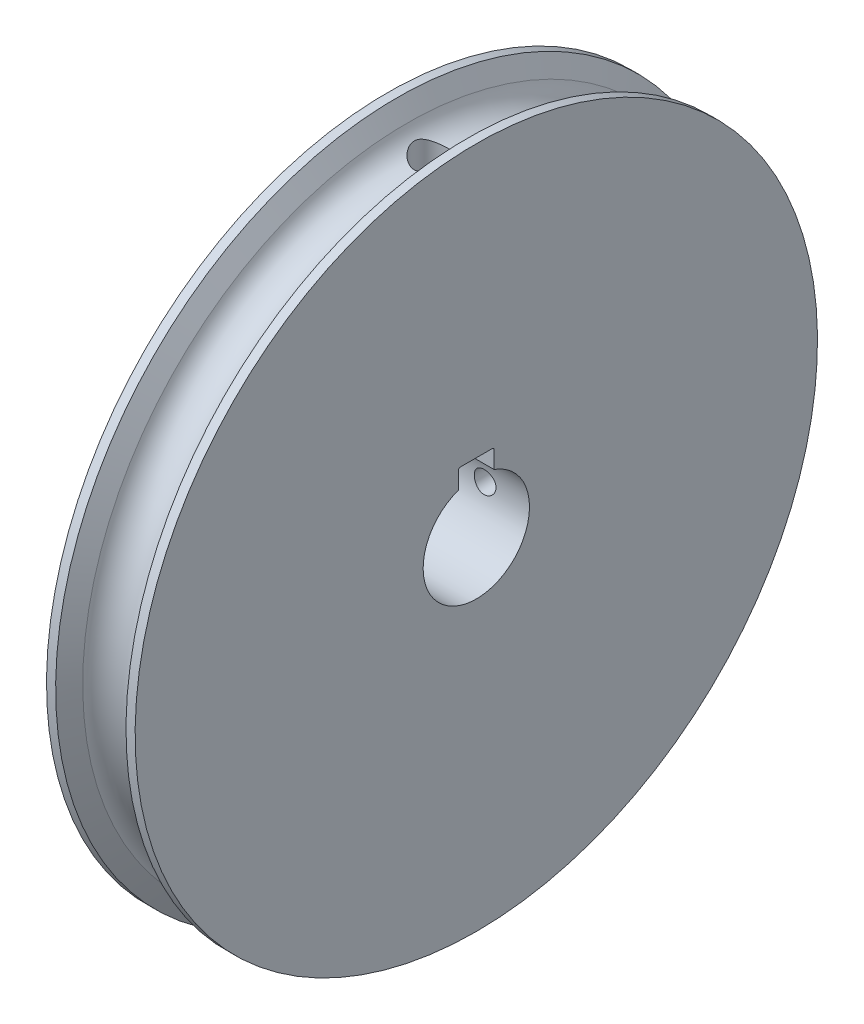
ISO-10303-21;
HEADER;
FILE_DESCRIPTION(('STEP AP214'),'2;1');
FILE_NAME('part.step','',(''),(''),'','','');
FILE_SCHEMA(('AUTOMOTIVE_DESIGN { 1 0 10303 214 1 1 1 1 }'));
ENDSEC;
DATA;
#1=APPLICATION_CONTEXT('core data for automotive mechanical design processes');
#2=APPLICATION_PROTOCOL_DEFINITION('international standard','automotive_design',2000,#1);
#3=PRODUCT_CONTEXT('',#1,'mechanical');
#4=PRODUCT('Part','Part','',(#3));
#5=PRODUCT_RELATED_PRODUCT_CATEGORY('part','',(#4));
#6=PRODUCT_DEFINITION_FORMATION('','',#4);
#7=PRODUCT_DEFINITION_CONTEXT('part definition',#1,'design');
#8=PRODUCT_DEFINITION('design','',#6,#7);
#9=PRODUCT_DEFINITION_SHAPE('','',#8);
#10=(LENGTH_UNIT() NAMED_UNIT(*) SI_UNIT(.MILLI.,.METRE.));
#11=(NAMED_UNIT(*) PLANE_ANGLE_UNIT() SI_UNIT($,.RADIAN.));
#12=(NAMED_UNIT(*) SI_UNIT($,.STERADIAN.) SOLID_ANGLE_UNIT());
#13=UNCERTAINTY_MEASURE_WITH_UNIT(LENGTH_MEASURE(1.E-05),#10,'distance_accuracy_value','');
#14=(GEOMETRIC_REPRESENTATION_CONTEXT(3) GLOBAL_UNCERTAINTY_ASSIGNED_CONTEXT((#13)) GLOBAL_UNIT_ASSIGNED_CONTEXT((#10,
#11,#12)) REPRESENTATION_CONTEXT('',''));
#15=CARTESIAN_POINT('',(0.,0.,0.));
#16=DIRECTION('',(0.,0.,1.));
#17=DIRECTION('',(1.,0.,0.));
#18=AXIS2_PLACEMENT_3D('',#15,#16,#17);
#19=CARTESIAN_POINT('',(5.,0.,0.));
#20=DIRECTION('',(-1.,0.,0.));
#21=DIRECTION('',(0.,-1.,0.));
#22=AXIS2_PLACEMENT_3D('',#19,#20,#21);
#23=CYLINDRICAL_SURFACE('',#22,38.5);
#24=CARTESIAN_POINT('',(5.,0.,0.));
#25=DIRECTION('',(-1.,0.,0.));
#26=DIRECTION('',(0.,-1.,0.));
#27=AXIS2_PLACEMENT_3D('',#24,#25,#26);
#28=CIRCLE('',#27,38.5);
#29=CARTESIAN_POINT('',(5.,-38.5,0.));
#30=VERTEX_POINT('',#29);
#31=EDGE_CURVE('E105',#30,#30,#28,.T.);
#32=ORIENTED_EDGE('',*,*,#31,.T.);
#33=EDGE_LOOP('',(#32));
#34=FACE_BOUND('',#33,.T.);
#35=CARTESIAN_POINT('',(3.96811878506867,0.,0.));
#36=DIRECTION('',(-1.,0.,0.));
#37=DIRECTION('',(0.,-1.,0.));
#38=AXIS2_PLACEMENT_3D('',#35,#36,#37);
#39=CIRCLE('',#38,38.5);
#40=CARTESIAN_POINT('',(3.96811878506867,-38.5,0.));
#41=VERTEX_POINT('',#40);
#42=EDGE_CURVE('E147',#41,#41,#39,.T.);
#43=ORIENTED_EDGE('',*,*,#42,.F.);
#44=EDGE_LOOP('',(#43));
#45=FACE_BOUND('',#44,.T.);
#46=ADVANCED_FACE('F33',(#34,#45),#23,.T.);
#47=CARTESIAN_POINT('',(2.85008479631878,0.,0.));
#48=DIRECTION('',(1.,0.,0.));
#49=DIRECTION('',(0.,1.,0.));
#50=AXIS2_PLACEMENT_3D('',#47,#48,#49);
#51=CONICAL_SURFACE('',#50,36.5635083268963,1.0471975511966);
#52=ORIENTED_EDGE('',*,*,#42,.T.);
#53=EDGE_LOOP('',(#52));
#54=FACE_BOUND('',#53,.T.);
#55=CARTESIAN_POINT('',(2.85008479631878,0.,0.));
#56=DIRECTION('',(-1.,0.,0.));
#57=DIRECTION('',(0.,-1.,0.));
#58=AXIS2_PLACEMENT_3D('',#55,#56,#57);
#59=CIRCLE('',#58,36.5635083268963);
#60=CARTESIAN_POINT('',(2.85008479631878,-36.5635083268963,0.));
#61=VERTEX_POINT('',#60);
#62=EDGE_CURVE('E144',#61,#61,#59,.T.);
#63=ORIENTED_EDGE('',*,*,#62,.F.);
#64=EDGE_LOOP('',(#63));
#65=FACE_BOUND('',#64,.T.);
#66=ADVANCED_FACE('F210',(#54,#65),#51,.T.);
#67=CARTESIAN_POINT('',(0.,0.,0.));
#68=DIRECTION('',(-1.,0.,0.));
#69=DIRECTION('',(0.,-1.,0.));
#70=AXIS2_PLACEMENT_3D('',#67,#68,#69);
#71=TOROIDAL_SURFACE('',#70,37.5,3.);
#72=CARTESIAN_POINT('',(-1.15413941724156,34.692461094384,-1.63338981101617));
#73=CARTESIAN_POINT('',(-1.25230378169774,34.7366892183068,-1.56402977918302));
#74=CARTESIAN_POINT('',(-1.34326250195518,34.7842256740335,-1.4865076607575));
#75=CARTESIAN_POINT('',(-1.50984156033293,34.8811479788153,-1.3170253662496));
#76=CARTESIAN_POINT('',(-1.58541668049777,34.9305387885207,-1.22502399672636));
#77=CARTESIAN_POINT('',(-1.72019212264538,35.0259229680696,-1.02729723519172));
#78=CARTESIAN_POINT('',(-1.77931106138128,35.0718986559854,-0.921507304963747));
#79=CARTESIAN_POINT('',(-1.87830408799473,35.1531929539632,-0.697706223730167));
#80=CARTESIAN_POINT('',(-1.91826018696473,35.1885567317905,-0.579749826312477));
#81=CARTESIAN_POINT('',(-1.96589158550592,35.2318262571962,-0.37693257407509));
#82=CARTESIAN_POINT('',(-1.97994790269483,35.2449957973718,-0.29469266150319));
#83=CARTESIAN_POINT('',(-1.99763853489898,35.2616536028737,-0.128162141087988));
#84=CARTESIAN_POINT('',(-2.00128534241967,35.2651534726585,-0.0438741138773785));
#85=CARTESIAN_POINT('',(-1.99790564236217,35.2619412198332,0.124319577006549));
#86=CARTESIAN_POINT('',(-1.99087395417937,35.2552241405323,0.208225035268269));
#87=CARTESIAN_POINT('',(-1.96662664448319,35.2325888515065,0.373315216826705));
#88=CARTESIAN_POINT('',(-1.94939681096507,35.2166578020199,0.454495975862765));
#89=CARTESIAN_POINT('',(-1.89932544733003,35.1719309098749,0.635414618105865));
#90=CARTESIAN_POINT('',(-1.86340366438842,35.1407428597673,0.73369715074629));
#91=CARTESIAN_POINT('',(-1.7780975469425,35.0711593498684,0.921436995301542));
#92=CARTESIAN_POINT('',(-1.72869330262463,35.0327532573739,1.01088098698074));
#93=CARTESIAN_POINT('',(-1.61653970547145,34.9519893265557,1.18215815698913));
#94=CARTESIAN_POINT('',(-1.553523887928,34.9095637918749,1.26378391890621));
#95=CARTESIAN_POINT('',(-1.41559977990129,34.8250865073783,1.41657140231414));
#96=CARTESIAN_POINT('',(-1.34068511933313,34.7830349705901,1.48772747929338));
#97=CARTESIAN_POINT('',(-1.16538662393937,34.6954607772761,1.62995356564607));
#98=CARTESIAN_POINT('',(-1.06284020732557,34.6506223071919,1.69882090819034));
#99=CARTESIAN_POINT('',(-0.843759682943349,34.571107956042,1.81755182623595));
#100=CARTESIAN_POINT('',(-0.727254680059566,34.5364114306797,1.86745406896164));
#101=CARTESIAN_POINT('',(-0.518114645596124,34.4895614347541,1.93390556274889));
#102=CARTESIAN_POINT('',(-0.427997062519046,34.4738111846652,1.955889909841));
#103=CARTESIAN_POINT('',(-0.244507864608128,34.4513014606904,1.98717199177387));
#104=CARTESIAN_POINT('',(-0.151139094534003,34.4445343199254,1.99648054529091));
#105=CARTESIAN_POINT('',(0.0363381340324808,34.4406219580363,2.00187171161903));
#106=CARTESIAN_POINT('',(0.130447559864104,34.4434926549763,1.99793244401988));
#107=CARTESIAN_POINT('',(0.316443611519483,34.4586108569616,1.97702520176859));
#108=CARTESIAN_POINT('',(0.408329409329265,34.4708618011534,1.96005244855054));
#109=CARTESIAN_POINT('',(0.58607374078757,34.5033835075449,1.91437189872763));
#110=CARTESIAN_POINT('',(0.672002093811127,34.5235309985971,1.88584426403442));
#111=CARTESIAN_POINT('',(0.837712593873513,34.5702914130123,1.81831037172738));
#112=CARTESIAN_POINT('',(0.917493459204588,34.5969056798741,1.77930193650648));
#113=CARTESIAN_POINT('',(1.07978157287123,34.6586069598435,1.68639023985453));
#114=CARTESIAN_POINT('',(1.16130869777871,34.6943444445486,1.63121355414477));
#115=CARTESIAN_POINT('',(1.31454962198745,34.7692897166195,1.51046205238269));
#116=CARTESIAN_POINT('',(1.38625098917966,34.8085017988707,1.4448742858935));
#117=CARTESIAN_POINT('',(1.53166972275211,34.8951178793617,1.29119371058307));
#118=CARTESIAN_POINT('',(1.60327325806761,34.9426868568972,1.20118467670636));
#119=CARTESIAN_POINT('',(1.73074629218862,35.0340043152423,1.00886366211702));
#120=CARTESIAN_POINT('',(1.78662618380259,35.0777553063575,0.906559871958913));
#121=CARTESIAN_POINT('',(1.86885467977422,35.1455607595233,0.717737618959305));
#122=CARTESIAN_POINT('',(1.89909551786027,35.1718021196619,0.633711259624011));
#123=CARTESIAN_POINT('',(1.94837927178807,35.2156826858437,0.460335280236325));
#124=CARTESIAN_POINT('',(1.96744235460812,35.2333373741371,0.370995569453687));
#125=CARTESIAN_POINT('',(1.99327850584055,35.2574844673992,0.18819184854205));
#126=CARTESIAN_POINT('',(1.99994473471001,35.2638798113305,0.0946990312850923));
#127=CARTESIAN_POINT('',(2.00005454761122,35.2639835510862,-0.092302756252155));
#128=CARTESIAN_POINT('',(1.99349928217178,35.2576930508273,-0.185811724418972));
#129=CARTESIAN_POINT('',(1.9692874137798,35.2350601366046,-0.358645253939931));
#130=CARTESIAN_POINT('',(1.95302392474172,35.2199840318559,-0.43834658037428));
#131=CARTESIAN_POINT('',(1.91155158307399,35.1827839382255,-0.593669000776356));
#132=CARTESIAN_POINT('',(1.88633461228924,35.1606535550712,-0.669286319834905));
#133=CARTESIAN_POINT('',(1.81434520284405,35.1001005784754,-0.849362898270387));
#134=CARTESIAN_POINT('',(1.76299484847957,35.0588704936857,-0.951047562273336));
#135=CARTESIAN_POINT('',(1.6450723152661,34.9717032148153,-1.14301030308801));
#136=CARTESIAN_POINT('',(1.57846969342849,34.9257567095108,-1.23326499889177));
#137=CARTESIAN_POINT('',(1.42988876751437,34.8331302591284,-1.40297908732453));
#138=CARTESIAN_POINT('',(1.34766191223214,34.7864515415155,-1.48222205661163));
#139=CARTESIAN_POINT('',(1.16951450428874,34.6975928580179,-1.62644694824355));
#140=CARTESIAN_POINT('',(1.07361500155134,34.6554061476526,-1.69145041007158));
#141=CARTESIAN_POINT('',(0.887054958295018,34.5862325915101,-1.79512155802151));
#142=CARTESIAN_POINT('',(0.798358547992226,34.5578787688613,-1.83639988523796));
#143=CARTESIAN_POINT('',(0.613887535200994,34.5093760665807,-1.90600055129711));
#144=CARTESIAN_POINT('',(0.518117940162055,34.4892214468915,-1.93433195567681));
#145=CARTESIAN_POINT('',(0.321251258114995,34.4589494567216,-1.97660905418097));
#146=CARTESIAN_POINT('',(0.220125983132287,34.4488922268299,-1.99046857232224));
#147=CARTESIAN_POINT('',(0.0164561945133712,34.4401483465175,-2.00252890840362));
#148=CARTESIAN_POINT('',(-0.0860878512932892,34.4414580331365,-2.00073477069428));
#149=CARTESIAN_POINT('',(-0.27889759491304,34.4545907762002,-1.98259071587212));
#150=CARTESIAN_POINT('',(-0.369378946286811,34.4653671173538,-1.96768979294115));
#151=CARTESIAN_POINT('',(-0.546170264235677,34.495053358758,-1.92612191842423));
#152=CARTESIAN_POINT('',(-0.632480167889638,34.5139633816526,-1.89945478942102));
#153=CARTESIAN_POINT('',(-0.794731727749451,34.5572473155712,-1.83726677201005));
#154=CARTESIAN_POINT('',(-0.870981138255738,34.5812741609108,-1.80229686097877));
#155=CARTESIAN_POINT('',(-1.01731169893415,34.6338437576692,-1.72394053369812));
#156=CARTESIAN_POINT('',(-1.08739131982433,34.6623876238273,-1.68055203925765));
#157=CARTESIAN_POINT('',(-1.15413941724156,34.692461094384,-1.63338981101617));
#158=B_SPLINE_CURVE_WITH_KNOTS('',3,(#72,#73,#74,#75,#76,#77,#78,#79,#80,#81,#82,#83,#84,#85,
#86,#87,#88,#89,#90,#91,#92,#93,#94,#95,#96,#97,#98,#99,#100,#101,#102,#103,#104,#105,#106,#107,
#108,#109,#110,#111,#112,#113,#114,#115,#116,#117,#118,#119,#120,#121,#122,#123,#124,#125,#126,
#127,#128,#129,#130,#131,#132,#133,#134,#135,#136,#137,#138,#139,#140,#141,#142,#143,#144,#145,
#146,#147,#148,#149,#150,#151,#152,#153,#154,#155,#156,#157),.UNSPECIFIED.,.T.,.F.,(4,2,2,2,2,2,
2,2,2,2,2,2,2,2,2,2,2,2,2,2,2,2,2,2,2,2,2,2,2,2,2,2,2,2,2,2,2,2,2,2,2,2,4),(0.,
0.383899910812011,0.768912446221426,1.15579651775696,1.54100973255824,1.79333121438528,
2.04534975634536,2.29749060257096,2.54998365912094,2.8757847187445,3.20206952317774,
3.53543878099646,3.86898711445636,4.2610190810902,4.65224740487232,4.9333006459964,
5.21411386003255,5.49539109934519,5.77677151473755,6.0539239302976,6.33113397469915,
6.64416914510999,6.95759679900477,7.32942646578239,7.70100978502768,7.97923195674305,
8.25695060125103,8.53705180459531,8.81712863470381,9.06433624961656,9.3117685833996,
9.67327001707356,10.0354993827277,10.4040642586035,10.7720677125067,11.0764026909134,
11.3805242438264,11.6864466025819,11.992270382282,12.2680147710441,12.5437633177725,
12.8047363975863,13.0657739827355),.UNSPECIFIED.);
#159=CARTESIAN_POINT('',(-1.15413941724156,34.692461094384,-1.63338981101617));
#160=VERTEX_POINT('',#159);
#161=EDGE_CURVE('E157',#160,#160,#158,.T.);
#162=ORIENTED_EDGE('',*,*,#161,.F.);
#163=EDGE_LOOP('',(#162));
#164=FACE_BOUND('',#163,.T.);
#165=CARTESIAN_POINT('',(-1.36904758300112,-1.45798107869875,-34.8000693125549));
#166=CARTESIAN_POINT('',(-1.45230066102804,-1.37980823084631,-34.8460841771348));
#167=CARTESIAN_POINT('',(-1.52856851885781,-1.29480005899666,-34.8934607267031));
#168=CARTESIAN_POINT('',(-1.66616980676115,-1.11219955605382,-34.9863525576055));
#169=CARTESIAN_POINT('',(-1.72746887929015,-1.01457904635514,-35.0318633611195));
#170=CARTESIAN_POINT('',(-1.82266800473996,-0.828538772640091,-35.106913428275));
#171=CARTESIAN_POINT('',(-1.85960069125495,-0.742235548056723,-35.1378225735872));
#172=CARTESIAN_POINT('',(-1.92142248770246,-0.563085836173174,-35.1913244071863));
#173=CARTESIAN_POINT('',(-1.9463427864739,-0.470257018644917,-35.2139385954757));
#174=CARTESIAN_POINT('',(-1.97991382844916,-0.294418270337335,-35.244896937915));
#175=CARTESIAN_POINT('',(-1.99046602878474,-0.212069601757359,-35.2548912682228));
#176=CARTESIAN_POINT('',(-2.00119369748807,-0.0461021289025892,-35.2650544071327));
#177=CARTESIAN_POINT('',(-2.00137495095492,0.0375159412367804,-35.2652286935296));
#178=CARTESIAN_POINT('',(-1.99136272323076,0.203411146937939,-35.2557387770639));
#179=CARTESIAN_POINT('',(-1.98118406489582,0.285690027702628,-35.2460886308943));
#180=CARTESIAN_POINT('',(-1.95113709803556,0.447010674580296,-35.2183419304));
#181=CARTESIAN_POINT('',(-1.93125624187717,0.526048104716766,-35.2002344396885));
#182=CARTESIAN_POINT('',(-1.87412995287297,0.706774904808957,-35.1500955064971));
#183=CARTESIAN_POINT('',(-1.833227136143,0.806560981909819,-35.1154035715571));
#184=CARTESIAN_POINT('',(-1.73736789044115,0.996450747955345,-35.0395175247242));
#185=CARTESIAN_POINT('',(-1.68238616089315,1.08653658664531,-34.9983117586735));
#186=CARTESIAN_POINT('',(-1.55828999585031,1.25824977342608,-34.9128212998097));
#187=CARTESIAN_POINT('',(-1.48889038341513,1.33964651123972,-34.8684887205271));
#188=CARTESIAN_POINT('',(-1.33756082557254,1.49075515237768,-34.7814664270744));
#189=CARTESIAN_POINT('',(-1.25564035108142,1.56047580477548,-34.7387755014346));
#190=CARTESIAN_POINT('',(-1.08519533192461,1.6830610200696,-34.6609312357362));
#191=CARTESIAN_POINT('',(-0.997356059147971,1.73668289900831,-34.6254801997364));
#192=CARTESIAN_POINT('',(-0.812271993451585,1.83056342348608,-34.5620203796626));
#193=CARTESIAN_POINT('',(-0.715031054088328,1.87082751438135,-34.5340085638918));
#194=CARTESIAN_POINT('',(-0.512332498863326,1.93621585182428,-34.4879552021129));
#195=CARTESIAN_POINT('',(-0.40681466902014,1.96121473144638,-34.4699963141756));
#196=CARTESIAN_POINT('',(-0.191790022136036,1.99374070303426,-34.4465495600723));
#197=CARTESIAN_POINT('',(-0.0822873644032746,2.00128551048361,-34.4410490490579));
#198=CARTESIAN_POINT('',(0.121084329401326,1.99855415709966,-34.4430279906724));
#199=CARTESIAN_POINT('',(0.215013020840474,1.99060691076075,-34.4488112711249));
#200=CARTESIAN_POINT('',(0.399829323723169,1.96185673757017,-34.4695306968107));
#201=CARTESIAN_POINT('',(0.490716529531242,1.94105210310638,-34.4844680578112));
#202=CARTESIAN_POINT('',(0.666628229248951,1.88785809502206,-34.5220663441322));
#203=CARTESIAN_POINT('',(0.751686337106683,1.85554325057143,-34.5446775375699));
#204=CARTESIAN_POINT('',(0.915132971575769,1.78062415419368,-34.5959458153228));
#205=CARTESIAN_POINT('',(0.993520270100642,1.73801801317132,-34.6246040095178));
#206=CARTESIAN_POINT('',(1.15378403972534,1.63677894370001,-34.6906810644609));
#207=CARTESIAN_POINT('',(1.23447437395675,1.57670983140978,-34.728768554851));
#208=CARTESIAN_POINT('',(1.38534361052622,1.44596345177179,-34.8077377381684));
#209=CARTESIAN_POINT('',(1.45550553666853,1.37526941221999,-34.8486237922398));
#210=CARTESIAN_POINT('',(1.59631265722341,1.21060204993595,-34.9375796394447));
#211=CARTESIAN_POINT('',(1.66477154490176,1.11472894737224,-34.9856177826711));
#212=CARTESIAN_POINT('',(1.78470047469914,0.910398927976042,-35.0758286662967));
#213=CARTESIAN_POINT('',(1.83619657918944,0.801961665112564,-35.1180103465846));
#214=CARTESIAN_POINT('',(1.9073311687978,0.607757354499867,-35.1789154497794));
#215=CARTESIAN_POINT('',(1.93188893460904,0.524821988333329,-35.2008851868682));
#216=CARTESIAN_POINT('',(1.97021480675596,0.354715664134413,-35.2358186758356));
#217=CARTESIAN_POINT('',(1.98400253975444,0.267552719633093,-35.2487988049182));
#218=CARTESIAN_POINT('',(1.99992686771436,0.0906464338012923,-35.2638332494485));
#219=CARTESIAN_POINT('',(2.001992211854,0.00089063834394636,-35.2658207478191));
#220=CARTESIAN_POINT('',(1.99410160029292,-0.177622783116481,-35.2583311222138));
#221=CARTESIAN_POINT('',(1.98413994019549,-0.266379915295391,-35.2488485579942));
#222=CARTESIAN_POINT('',(1.95415213091574,-0.433546639966237,-35.2211031301235));
#223=CARTESIAN_POINT('',(1.93494454448577,-0.512231027201161,-35.2035589180089));
#224=CARTESIAN_POINT('',(1.88784587085471,-0.665170117230624,-35.1620617302631));
#225=CARTESIAN_POINT('',(1.85994792814215,-0.739421267502813,-35.1381036971029));
#226=CARTESIAN_POINT('',(1.78044517983108,-0.918611872652629,-35.0728526270391));
#227=CARTESIAN_POINT('',(1.72395394776525,-1.02041115215992,-35.0288697093417));
#228=CARTESIAN_POINT('',(1.59525428915473,-1.21182019926542,-34.9372448946515));
#229=CARTESIAN_POINT('',(1.52301329528111,-1.30140407451024,-34.8895955503365));
#230=CARTESIAN_POINT('',(1.36279061129153,-1.46845838480722,-34.7949458029725));
#231=CARTESIAN_POINT('',(1.27460667247392,-1.54574588224915,-34.7479632564678));
#232=CARTESIAN_POINT('',(1.08419598969494,-1.68474172445829,-34.6600106478821));
#233=CARTESIAN_POINT('',(0.981997018328656,-1.74648021182307,-34.6190290183075));
#234=CARTESIAN_POINT('',(0.788396963594559,-1.84049148959454,-34.5551221877219));
#235=CARTESIAN_POINT('',(0.699342955264505,-1.87624045444262,-34.5302100779469));
#236=CARTESIAN_POINT('',(0.515219362660513,-1.93490614532335,-34.4888625746944));
#237=CARTESIAN_POINT('',(0.420154218869142,-1.95783222328184,-34.4724210042165));
#238=CARTESIAN_POINT('',(0.226006307364135,-1.98963237207463,-34.4495222505443));
#239=CARTESIAN_POINT('',(0.12690636849457,-1.99843811148009,-34.443113622487));
#240=CARTESIAN_POINT('',(-0.0715997319205106,-2.00117951756136,-34.4411243157779));
#241=CARTESIAN_POINT('',(-0.171005823745406,-1.99511835112579,-34.4455413310908));
#242=CARTESIAN_POINT('',(-0.359197397446337,-1.96959353304605,-34.4639656282881));
#243=CARTESIAN_POINT('',(-0.448209592170721,-1.95120295564931,-34.4772045843056));
#244=CARTESIAN_POINT('',(-0.621588084824628,-1.90308464891416,-34.5113551962395));
#245=CARTESIAN_POINT('',(-0.705951335232654,-1.87334958176499,-34.5322718178693));
#246=CARTESIAN_POINT('',(-0.874139812445671,-1.80134102442878,-34.5819008106248));
#247=CARTESIAN_POINT('',(-0.957518510187956,-1.7583386187004,-34.6110546068503));
#248=CARTESIAN_POINT('',(-1.11603250376105,-1.6622441088945,-34.6742509049628));
#249=CARTESIAN_POINT('',(-1.19117722721272,-1.60916373821307,-34.7082877105935));
#250=CARTESIAN_POINT('',(-1.29882421380992,-1.52161761850975,-34.7621535462265));
#251=CARTESIAN_POINT('',(-1.33453607276308,-1.49038664378937,-34.7809944325903));
#252=CARTESIAN_POINT('',(-1.36904758300112,-1.45798107869875,-34.8000693125549));
#253=B_SPLINE_CURVE_WITH_KNOTS('',3,(#165,#166,#167,#168,#169,#170,#171,#172,#173,#174,#175,
#176,#177,#178,#179,#180,#181,#182,#183,#184,#185,#186,#187,#188,#189,#190,#191,#192,#193,#194,
#195,#196,#197,#198,#199,#200,#201,#202,#203,#204,#205,#206,#207,#208,#209,#210,#211,#212,#213,
#214,#215,#216,#217,#218,#219,#220,#221,#222,#223,#224,#225,#226,#227,#228,#229,#230,#231,#232,
#233,#234,#235,#236,#237,#238,#239,#240,#241,#242,#243,#244,#245,#246,#247,#248,#249,#250,#251,
#252),.UNSPECIFIED.,.T.,.F.,(4,2,2,2,2,2,2,2,2,2,2,2,2,2,2,2,2,2,2,2,2,2,2,2,2,2,2,2,2,2,2,2,2,
2,2,2,2,2,2,2,2,2,2,4),(0.,0.369246184478657,0.739332089606717,1.03476130182635,
1.32941927694662,1.57914522121273,1.82873186253473,2.07796189914939,2.32751511695283,
2.66554057064839,3.0041777906077,3.35029014838599,3.69614198695893,4.0213668040584,
4.34645887856868,4.67418610219512,5.00158054397702,5.28351768686113,5.56549228235798,
5.84567331264226,6.1259058127698,6.4474065529115,6.76942024148951,7.14939702589327,
7.52878724401749,7.79550226712976,8.06173010342137,8.32957440235686,8.59754578951205,
8.84524110390126,9.09313231322916,9.46452127780584,9.83668560932155,10.213952921565,
10.5904831516206,10.8866934090736,11.1826873532581,11.4801094010545,11.7774680987023,
12.0518234485067,12.3263565577476,12.6200064132874,12.913316456865,13.0663827912036),.UNSPECIFIED.);
#254=CARTESIAN_POINT('',(-1.36904758300112,-1.45798107869875,-34.8000693125549));
#255=VERTEX_POINT('',#254);
#256=EDGE_CURVE('E150',#255,#255,#253,.T.);
#257=ORIENTED_EDGE('',*,*,#256,.F.);
#258=EDGE_LOOP('',(#257));
#259=FACE_BOUND('',#258,.T.);
#260=ORIENTED_EDGE('',*,*,#62,.T.);
#261=EDGE_LOOP('',(#260));
#262=FACE_BOUND('',#261,.T.);
#263=CARTESIAN_POINT('',(-2.85008479631877,0.,0.));
#264=DIRECTION('',(-1.,0.,0.));
#265=DIRECTION('',(0.,-1.,0.));
#266=AXIS2_PLACEMENT_3D('',#263,#264,#265);
#267=CIRCLE('',#266,36.5635083268963);
#268=CARTESIAN_POINT('',(-2.85008479631877,-36.5635083268963,0.));
#269=VERTEX_POINT('',#268);
#270=EDGE_CURVE('E141',#269,#269,#267,.T.);
#271=ORIENTED_EDGE('',*,*,#270,.F.);
#272=EDGE_LOOP('',(#271));
#273=FACE_BOUND('',#272,.T.);
#274=ADVANCED_FACE('F162',(#164,#259,#262,#273),#71,.F.);
#275=CARTESIAN_POINT('',(-3.96811878506867,0.,0.));
#276=DIRECTION('',(-1.,0.,0.));
#277=DIRECTION('',(0.,-1.,0.));
#278=AXIS2_PLACEMENT_3D('',#275,#276,#277);
#279=CONICAL_SURFACE('',#278,38.5,1.04719755119659);
#280=ORIENTED_EDGE('',*,*,#270,.T.);
#281=EDGE_LOOP('',(#280));
#282=FACE_BOUND('',#281,.T.);
#283=CARTESIAN_POINT('',(-3.96811878506867,0.,0.));
#284=DIRECTION('',(-1.,0.,0.));
#285=DIRECTION('',(0.,-1.,0.));
#286=AXIS2_PLACEMENT_3D('',#283,#284,#285);
#287=CIRCLE('',#286,38.5);
#288=CARTESIAN_POINT('',(-3.96811878506867,-38.5,0.));
#289=VERTEX_POINT('',#288);
#290=EDGE_CURVE('E138',#289,#289,#287,.T.);
#291=ORIENTED_EDGE('',*,*,#290,.F.);
#292=EDGE_LOOP('',(#291));
#293=FACE_BOUND('',#292,.T.);
#294=ADVANCED_FACE('F203',(#282,#293),#279,.T.);
#295=CARTESIAN_POINT('',(5.,0.,0.));
#296=DIRECTION('',(-1.,0.,0.));
#297=DIRECTION('',(0.,-1.,0.));
#298=AXIS2_PLACEMENT_3D('',#295,#296,#297);
#299=CYLINDRICAL_SURFACE('',#298,38.5);
#300=ORIENTED_EDGE('',*,*,#290,.T.);
#301=EDGE_LOOP('',(#300));
#302=FACE_BOUND('',#301,.T.);
#303=CARTESIAN_POINT('',(-5.,0.,0.));
#304=DIRECTION('',(-1.,0.,0.));
#305=DIRECTION('',(0.,-1.,0.));
#306=AXIS2_PLACEMENT_3D('',#303,#304,#305);
#307=CIRCLE('',#306,38.5);
#308=CARTESIAN_POINT('',(-5.,-38.5,0.));
#309=VERTEX_POINT('',#308);
#310=EDGE_CURVE('E135',#309,#309,#307,.T.);
#311=ORIENTED_EDGE('',*,*,#310,.F.);
#312=EDGE_LOOP('',(#311));
#313=FACE_BOUND('',#312,.T.);
#314=ADVANCED_FACE('F201',(#302,#313),#299,.T.);
#315=CARTESIAN_POINT('',(-5.,0.,0.));
#316=DIRECTION('',(-1.,0.,0.));
#317=DIRECTION('',(0.,-1.,0.));
#318=AXIS2_PLACEMENT_3D('',#315,#316,#317);
#319=PLANE('',#318);
#320=CARTESIAN_POINT('',(-5.,0.,0.));
#321=DIRECTION('',(-1.,0.,0.));
#322=DIRECTION('',(0.,0.,1.));
#323=AXIS2_PLACEMENT_3D('',#320,#321,#322);
#324=CIRCLE('',#323,6.);
#325=CARTESIAN_POINT('',(-5.,5.65685424949238,-2.));
#326=VERTEX_POINT('',#325);
#327=CARTESIAN_POINT('',(-5.,5.65685424949238,2.));
#328=VERTEX_POINT('',#327);
#329=EDGE_CURVE('E101',#326,#328,#324,.T.);
#330=ORIENTED_EDGE('',*,*,#329,.F.);
#331=DIRECTION('',(0.,-1.,0.));
#332=VECTOR('',#331,1.);
#333=CARTESIAN_POINT('',(-5.,7.8,-2.));
#334=LINE('',#333,#332);
#335=CARTESIAN_POINT('',(-5.,7.6,-2.));
#336=VERTEX_POINT('',#335);
#337=EDGE_CURVE('E87',#336,#326,#334,.T.);
#338=ORIENTED_EDGE('',*,*,#337,.F.);
#339=CARTESIAN_POINT('',(-5.,7.6,-1.8));
#340=DIRECTION('',(-1.,0.,0.));
#341=DIRECTION('',(0.,-1.,0.));
#342=AXIS2_PLACEMENT_3D('',#339,#340,#341);
#343=CIRCLE('',#342,0.199999999999999);
#344=CARTESIAN_POINT('',(-5.,7.8,-1.8));
#345=VERTEX_POINT('',#344);
#346=EDGE_CURVE('E241',#336,#345,#343,.F.);
#347=ORIENTED_EDGE('',*,*,#346,.T.);
#348=DIRECTION('',(0.,0.,-1.));
#349=VECTOR('',#348,1.);
#350=CARTESIAN_POINT('',(-5.,7.8,2.));
#351=LINE('',#350,#349);
#352=CARTESIAN_POINT('',(-5.,7.8,1.8));
#353=VERTEX_POINT('',#352);
#354=EDGE_CURVE('E96',#353,#345,#351,.T.);
#355=ORIENTED_EDGE('',*,*,#354,.F.);
#356=CARTESIAN_POINT('',(-5.,7.6,1.8));
#357=DIRECTION('',(-1.,0.,0.));
#358=DIRECTION('',(0.,-1.,0.));
#359=AXIS2_PLACEMENT_3D('',#356,#357,#358);
#360=CIRCLE('',#359,0.199999999999999);
#361=CARTESIAN_POINT('',(-5.,7.6,2.));
#362=VERTEX_POINT('',#361);
#363=EDGE_CURVE('E41',#353,#362,#360,.F.);
#364=ORIENTED_EDGE('',*,*,#363,.T.);
#365=DIRECTION('',(0.,1.,0.));
#366=VECTOR('',#365,1.);
#367=CARTESIAN_POINT('',(-5.,5.65685424949238,2.));
#368=LINE('',#367,#366);
#369=EDGE_CURVE('E110',#328,#362,#368,.T.);
#370=ORIENTED_EDGE('',*,*,#369,.F.);
#371=EDGE_LOOP('',(#330,#338,#347,#355,#364,#370));
#372=FACE_BOUND('',#371,.T.);
#373=ORIENTED_EDGE('',*,*,#310,.T.);
#374=EDGE_LOOP('',(#373));
#375=FACE_BOUND('',#374,.T.);
#376=ADVANCED_FACE('F108',(#372,#375),#319,.T.);
#377=CARTESIAN_POINT('',(5.,38.5,0.));
#378=DIRECTION('',(1.,0.,0.));
#379=DIRECTION('',(0.,1.,0.));
#380=AXIS2_PLACEMENT_3D('',#377,#378,#379);
#381=PLANE('',#380);
#382=CARTESIAN_POINT('',(5.,0.,0.));
#383=DIRECTION('',(-1.,0.,0.));
#384=DIRECTION('',(0.,0.,1.));
#385=AXIS2_PLACEMENT_3D('',#382,#383,#384);
#386=CIRCLE('',#385,6.);
#387=CARTESIAN_POINT('',(5.,5.65685424949238,-2.));
#388=VERTEX_POINT('',#387);
#389=CARTESIAN_POINT('',(5.,5.65685424949238,2.));
#390=VERTEX_POINT('',#389);
#391=EDGE_CURVE('E104',#388,#390,#386,.T.);
#392=ORIENTED_EDGE('',*,*,#391,.T.);
#393=DIRECTION('',(0.,1.,0.));
#394=VECTOR('',#393,1.);
#395=CARTESIAN_POINT('',(5.,5.65685424949238,2.));
#396=LINE('',#395,#394);
#397=CARTESIAN_POINT('',(5.,7.6,2.));
#398=VERTEX_POINT('',#397);
#399=EDGE_CURVE('E95',#390,#398,#396,.T.);
#400=ORIENTED_EDGE('',*,*,#399,.T.);
#401=CARTESIAN_POINT('',(5.,7.6,1.8));
#402=DIRECTION('',(1.,0.,0.));
#403=DIRECTION('',(0.,1.,0.));
#404=AXIS2_PLACEMENT_3D('',#401,#402,#403);
#405=CIRCLE('',#404,0.199999999999999);
#406=CARTESIAN_POINT('',(5.,7.8,1.8));
#407=VERTEX_POINT('',#406);
#408=EDGE_CURVE('E11',#398,#407,#405,.F.);
#409=ORIENTED_EDGE('',*,*,#408,.T.);
#410=DIRECTION('',(0.,0.,-1.));
#411=VECTOR('',#410,1.);
#412=CARTESIAN_POINT('',(5.,7.8,2.));
#413=LINE('',#412,#411);
#414=CARTESIAN_POINT('',(5.,7.8,-1.8));
#415=VERTEX_POINT('',#414);
#416=EDGE_CURVE('E124',#407,#415,#413,.T.);
#417=ORIENTED_EDGE('',*,*,#416,.T.);
#418=CARTESIAN_POINT('',(5.,7.6,-1.8));
#419=DIRECTION('',(1.,0.,0.));
#420=DIRECTION('',(0.,1.,0.));
#421=AXIS2_PLACEMENT_3D('',#418,#419,#420);
#422=CIRCLE('',#421,0.199999999999999);
#423=CARTESIAN_POINT('',(5.,7.6,-2.));
#424=VERTEX_POINT('',#423);
#425=EDGE_CURVE('E239',#415,#424,#422,.F.);
#426=ORIENTED_EDGE('',*,*,#425,.T.);
#427=DIRECTION('',(0.,-1.,0.));
#428=VECTOR('',#427,1.);
#429=CARTESIAN_POINT('',(5.,7.8,-2.));
#430=LINE('',#429,#428);
#431=EDGE_CURVE('E127',#424,#388,#430,.T.);
#432=ORIENTED_EDGE('',*,*,#431,.T.);
#433=EDGE_LOOP('',(#392,#400,#409,#417,#426,#432));
#434=FACE_BOUND('',#433,.T.);
#435=ORIENTED_EDGE('',*,*,#31,.F.);
#436=EDGE_LOOP('',(#435));
#437=FACE_BOUND('',#436,.T.);
#438=ADVANCED_FACE('F190',(#434,#437),#381,.T.);
#439=CARTESIAN_POINT('',(5.,7.8,-2.));
#440=DIRECTION('',(0.,0.,-1.));
#441=DIRECTION('',(-1.,0.,0.));
#442=AXIS2_PLACEMENT_3D('',#439,#440,#441);
#443=PLANE('',#442);
#444=ORIENTED_EDGE('',*,*,#431,.F.);
#445=DIRECTION('',(-1.,0.,0.));
#446=VECTOR('',#445,1.);
#447=CARTESIAN_POINT('',(-5.,7.6,-2.));
#448=LINE('',#447,#446);
#449=EDGE_CURVE('E93',#424,#336,#448,.T.);
#450=ORIENTED_EDGE('',*,*,#449,.T.);
#451=ORIENTED_EDGE('',*,*,#337,.T.);
#452=DIRECTION('',(-1.,0.,0.));
#453=VECTOR('',#452,1.);
#454=CARTESIAN_POINT('',(5.,5.65685424949238,-2.));
#455=LINE('',#454,#453);
#456=EDGE_CURVE('E91',#388,#326,#455,.T.);
#457=ORIENTED_EDGE('',*,*,#456,.F.);
#458=EDGE_LOOP('',(#444,#450,#451,#457));
#459=FACE_BOUND('',#458,.T.);
#460=ADVANCED_FACE('F90',(#459),#443,.F.);
#461=CARTESIAN_POINT('',(5.,7.8,2.));
#462=DIRECTION('',(0.,1.,0.));
#463=DIRECTION('',(0.,0.,1.));
#464=AXIS2_PLACEMENT_3D('',#461,#462,#463);
#465=PLANE('',#464);
#466=CARTESIAN_POINT('',(0.,7.8,0.));
#467=DIRECTION('',(0.,1.,0.));
#468=DIRECTION('',(0.,0.,1.));
#469=AXIS2_PLACEMENT_3D('',#466,#467,#468);
#470=CIRCLE('',#469,1.2295);
#471=CARTESIAN_POINT('',(0.,7.8,1.2295));
#472=VERTEX_POINT('',#471);
#473=EDGE_CURVE('E278',#472,#472,#470,.T.);
#474=ORIENTED_EDGE('',*,*,#473,.T.);
#475=EDGE_LOOP('',(#474));
#476=FACE_BOUND('',#475,.T.);
#477=ORIENTED_EDGE('',*,*,#354,.T.);
#478=DIRECTION('',(-1.,0.,0.));
#479=VECTOR('',#478,1.);
#480=CARTESIAN_POINT('',(5.,7.8,-1.8));
#481=LINE('',#480,#479);
#482=EDGE_CURVE('E240',#345,#415,#481,.F.);
#483=ORIENTED_EDGE('',*,*,#482,.T.);
#484=ORIENTED_EDGE('',*,*,#416,.F.);
#485=DIRECTION('',(-1.,0.,0.));
#486=VECTOR('',#485,1.);
#487=CARTESIAN_POINT('',(-5.,7.8,1.8));
#488=LINE('',#487,#486);
#489=EDGE_CURVE('E247',#407,#353,#488,.T.);
#490=ORIENTED_EDGE('',*,*,#489,.T.);
#491=EDGE_LOOP('',(#477,#483,#484,#490));
#492=FACE_BOUND('',#491,.T.);
#493=ADVANCED_FACE('F189',(#476,#492),#465,.F.);
#494=CARTESIAN_POINT('',(5.,5.65685424949238,2.));
#495=DIRECTION('',(0.,0.,1.));
#496=DIRECTION('',(0.,-1.,0.));
#497=AXIS2_PLACEMENT_3D('',#494,#495,#496);
#498=PLANE('',#497);
#499=ORIENTED_EDGE('',*,*,#369,.T.);
#500=DIRECTION('',(-1.,0.,0.));
#501=VECTOR('',#500,1.);
#502=CARTESIAN_POINT('',(5.,7.6,2.));
#503=LINE('',#502,#501);
#504=EDGE_CURVE('E48',#362,#398,#503,.F.);
#505=ORIENTED_EDGE('',*,*,#504,.T.);
#506=ORIENTED_EDGE('',*,*,#399,.F.);
#507=DIRECTION('',(-1.,0.,0.));
#508=VECTOR('',#507,1.);
#509=CARTESIAN_POINT('',(5.,5.65685424949238,2.));
#510=LINE('',#509,#508);
#511=EDGE_CURVE('E106',#390,#328,#510,.T.);
#512=ORIENTED_EDGE('',*,*,#511,.T.);
#513=EDGE_LOOP('',(#499,#505,#506,#512));
#514=FACE_BOUND('',#513,.T.);
#515=ADVANCED_FACE('F185',(#514),#498,.F.);
#516=CARTESIAN_POINT('',(5.,0.,0.));
#517=DIRECTION('',(-1.,0.,0.));
#518=DIRECTION('',(0.,0.,1.));
#519=AXIS2_PLACEMENT_3D('',#516,#517,#518);
#520=CYLINDRICAL_SURFACE('',#519,6.);
#521=CARTESIAN_POINT('',(-1.2295,0.,-6.));
#522=CARTESIAN_POINT('',(-1.22949753064128,0.0682960564925699,-5.99999873721602));
#523=CARTESIAN_POINT('',(-1.22379022941645,0.136622969812282,-5.9988219739698));
#524=CARTESIAN_POINT('',(-1.20113136251155,0.271343060660191,-5.99424117663892));
#525=CARTESIAN_POINT('',(-1.18417109230433,0.33773469965701,-5.99083541838388));
#526=CARTESIAN_POINT('',(-1.13955417197444,0.466617152518196,-5.98217665454292));
#527=CARTESIAN_POINT('',(-1.11190800493149,0.529111719924702,-5.97692545982423));
#528=CARTESIAN_POINT('',(-1.0467357670089,0.648571627048643,-5.9651456308159));
#529=CARTESIAN_POINT('',(-1.0092101989712,0.705537247976594,-5.95861706154643));
#530=CARTESIAN_POINT('',(-0.924780414113945,0.813133897056238,-5.94489664361969));
#531=CARTESIAN_POINT('',(-0.877763080570228,0.863675232121719,-5.93769742074221));
#532=CARTESIAN_POINT('',(-0.77592749862376,0.956211706225152,-5.92350030692733));
#533=CARTESIAN_POINT('',(-0.72110862049953,0.998206154713859,-5.91650243229713));
#534=CARTESIAN_POINT('',(-0.604576294574531,1.07284211229358,-5.90342816415929));
#535=CARTESIAN_POINT('',(-0.542801780042811,1.10539008298121,-5.89736124932101));
#536=CARTESIAN_POINT('',(-0.414515732841863,1.15960973595846,-5.88694084399423));
#537=CARTESIAN_POINT('',(-0.34800469370023,1.18128254950957,-5.88258717529967));
#538=CARTESIAN_POINT('',(-0.213100682063732,1.21284415499174,-5.87616094260941));
#539=CARTESIAN_POINT('',(-0.144746096800448,1.22289068640039,-5.87405787388331));
#540=CARTESIAN_POINT('',(-0.0072917226198634,1.23140463032179,-5.87227919412438));
#541=CARTESIAN_POINT('',(0.0618079854197118,1.2298732871448,-5.87260332223312));
#542=CARTESIAN_POINT('',(0.197632372600613,1.21540233348096,-5.87561472286793));
#543=CARTESIAN_POINT('',(0.264377340213351,1.20264415794209,-5.87826441064443));
#544=CARTESIAN_POINT('',(0.394759000003324,1.16636835470482,-5.88556913642474));
#545=CARTESIAN_POINT('',(0.45839553691654,1.14285019015919,-5.89022427448565));
#546=CARTESIAN_POINT('',(0.581273533298374,1.08555046034894,-5.90105345613852));
#547=CARTESIAN_POINT('',(0.640480750290979,1.05169753012788,-5.90723800252593));
#548=CARTESIAN_POINT('',(0.752442008511643,0.974739537310906,-5.92042249365734));
#549=CARTESIAN_POINT('',(0.805195271581601,0.931633360766656,-5.92742253652811));
#550=CARTESIAN_POINT('',(0.90379748814766,0.836423869810388,-5.94161172250805));
#551=CARTESIAN_POINT('',(0.949497031314652,0.784165845452457,-5.94880193849055));
#552=CARTESIAN_POINT('',(1.03150580991209,0.672648742287864,-5.96244028296239));
#553=CARTESIAN_POINT('',(1.06781491313897,0.613389564932381,-5.96888840100338));
#554=CARTESIAN_POINT('',(1.13004211018601,0.489382177547133,-5.98033309994091));
#555=CARTESIAN_POINT('',(1.15594249023521,0.424624835523341,-5.98532720241981));
#556=CARTESIAN_POINT('',(1.196454309722,0.291552723408713,-5.99328247091801));
#557=CARTESIAN_POINT('',(1.21106718606094,0.22323840730357,-5.99624389569222));
#558=CARTESIAN_POINT('',(1.22837619339123,0.0862748780865441,-5.99976389836459));
#559=CARTESIAN_POINT('',(1.2312766975358,0.0176525199513412,-6.00036368069286));
#560=CARTESIAN_POINT('',(1.22562992858542,-0.119096251059983,-5.99920752704136));
#561=CARTESIAN_POINT('',(1.21708333257418,-0.187222693029378,-5.99745173039154));
#562=CARTESIAN_POINT('',(1.18895469013411,-0.320381912579537,-5.99180754192012));
#563=CARTESIAN_POINT('',(1.16947810159765,-0.385437907411332,-5.98793953915742));
#564=CARTESIAN_POINT('',(1.12015804319363,-0.511360467150124,-5.97850323539985));
#565=CARTESIAN_POINT('',(1.09031376828101,-0.572226706285066,-5.97293480237157));
#566=CARTESIAN_POINT('',(1.0206675403568,-0.68889964004155,-5.96061290965757));
#567=CARTESIAN_POINT('',(0.980743300417008,-0.744631802837912,-5.95384522590294));
#568=CARTESIAN_POINT('',(0.892233486631045,-0.848678887330462,-5.93990780024498));
#569=CARTESIAN_POINT('',(0.843646934560006,-0.896992970163389,-5.9327380129953));
#570=CARTESIAN_POINT('',(0.738259336758048,-0.985626142294934,-5.91866468637139));
#571=CARTESIAN_POINT('',(0.681339061741358,-1.02580460569165,-5.91176725997371));
#572=CARTESIAN_POINT('',(0.561437695703564,-1.09603113988656,-5.89915197065621));
#573=CARTESIAN_POINT('',(0.498456853307949,-1.12607962602399,-5.89343405937881));
#574=CARTESIAN_POINT('',(0.368545897751002,-1.17500433094382,-5.88387516620516));
#575=CARTESIAN_POINT('',(0.30163890957759,-1.19393991565051,-5.88002423036747));
#576=CARTESIAN_POINT('',(0.165505063421949,-1.22027993947682,-5.87461496042671));
#577=CARTESIAN_POINT('',(0.0962785263985937,-1.22768596727964,-5.87305631046614));
#578=CARTESIAN_POINT('',(-0.0411159665828795,-1.23069557602404,-5.872426234788));
#579=CARTESIAN_POINT('',(-0.109278932608173,-1.22652154951194,-5.87330794174919));
#580=CARTESIAN_POINT('',(-0.243908820346054,-1.20698197651136,-5.87735419282085));
#581=CARTESIAN_POINT('',(-0.310375757210582,-1.19161653004073,-5.88051871652975));
#582=CARTESIAN_POINT('',(-0.439576379312346,-1.15023163351575,-5.88875259496054));
#583=CARTESIAN_POINT('',(-0.50231956357579,-1.1242407553357,-5.89381683833396));
#584=CARTESIAN_POINT('',(-0.622589066325615,-1.06236885192556,-5.90528221328859));
#585=CARTESIAN_POINT('',(-0.680114919189029,-1.02648694511843,-5.91168346402355));
#586=CARTESIAN_POINT('',(-0.789421417231227,-0.945097544687503,-5.92524413405648));
#587=CARTESIAN_POINT('',(-0.841081467416139,-0.899429973259617,-5.93241502764424));
#588=CARTESIAN_POINT('',(-0.936078434093776,-0.800094573383082,-5.94662602426888));
#589=CARTESIAN_POINT('',(-0.97941343345182,-0.746424907213589,-5.95366609684328));
#590=CARTESIAN_POINT('',(-1.05698553673531,-0.631893208614044,-5.96691440495243));
#591=CARTESIAN_POINT('',(-1.09111645896828,-0.570958039622947,-5.97311255385713));
#592=CARTESIAN_POINT('',(-1.14859929974673,-0.444105668912032,-5.98387894471461));
#593=CARTESIAN_POINT('',(-1.17196076371695,-0.3781929395643,-5.98844862922532));
#594=CARTESIAN_POINT('',(-1.20280815911392,-0.260126813647789,-5.99457372020177));
#595=CARTESIAN_POINT('',(-1.21279944117834,-0.208637497361188,-5.99659649220145));
#596=CARTESIAN_POINT('',(-1.22614619341538,-0.104771487053282,-5.9993100933202));
#597=CARTESIAN_POINT('',(-1.22950189442292,-0.0523948239644387,-6.00000096877254));
#598=CARTESIAN_POINT('',(-1.2295,0.,-6.));
#599=B_SPLINE_CURVE_WITH_KNOTS('',3,(#521,#522,#523,#524,#525,#526,#527,#528,#529,#530,#531,
#532,#533,#534,#535,#536,#537,#538,#539,#540,#541,#542,#543,#544,#545,#546,#547,#548,#549,#550,
#551,#552,#553,#554,#555,#556,#557,#558,#559,#560,#561,#562,#563,#564,#565,#566,#567,#568,#569,
#570,#571,#572,#573,#574,#575,#576,#577,#578,#579,#580,#581,#582,#583,#584,#585,#586,#587,#588,
#589,#590,#591,#592,#593,#594,#595,#596,#597,#598),.UNSPECIFIED.,.T.,.F.,(4,2,2,2,2,2,2,2,2,2,2,
2,2,2,2,2,2,2,2,2,2,2,2,2,2,2,2,2,2,2,2,2,2,2,2,2,2,2,4),(0.,0.204696466027641,
0.409551456129186,0.614205987352768,0.818850104079067,1.02609466776892,1.2333559692278,
1.4426045304347,1.65183132055959,1.85818485715955,2.06451621661751,2.26757309620456,
2.47064010799614,2.67514235915376,2.87966924305308,3.08806340618476,3.29646050303983,
3.50521076742796,3.71393445348643,3.91899988761996,4.1240531928885,4.32716124253723,
4.53028506693892,4.73600265382573,4.94174348689324,5.15078345191603,5.3598148450475,
5.56771916637426,5.77559483756741,5.97950608157298,6.18341550324355,6.38678018009852,
6.59016298849828,6.79716871971672,7.00422206426505,7.21357073176046,7.4227334862484,
7.57977635183405,7.73681375420336),.UNSPECIFIED.);
#600=CARTESIAN_POINT('',(-1.2295,0.,-6.));
#601=VERTEX_POINT('',#600);
#602=EDGE_CURVE('E111',#601,#601,#599,.T.);
#603=ORIENTED_EDGE('',*,*,#602,.T.);
#604=EDGE_LOOP('',(#603));
#605=FACE_BOUND('',#604,.T.);
#606=ORIENTED_EDGE('',*,*,#329,.T.);
#607=ORIENTED_EDGE('',*,*,#511,.F.);
#608=ORIENTED_EDGE('',*,*,#391,.F.);
#609=ORIENTED_EDGE('',*,*,#456,.T.);
#610=EDGE_LOOP('',(#606,#607,#608,#609));
#611=FACE_BOUND('',#610,.T.);
#612=ADVANCED_FACE('F100',(#605,#611),#520,.F.);
#613=CARTESIAN_POINT('',(0.,0.,-35.2639320225002));
#614=DIRECTION('',(0.,0.,-1.));
#615=DIRECTION('',(-1.,0.,0.));
#616=AXIS2_PLACEMENT_3D('',#613,#614,#615);
#617=CYLINDRICAL_SURFACE('',#616,1.2295);
#618=CARTESIAN_POINT('',(0.,0.,-11.7295000000459));
#619=DIRECTION('',(0.,0.,1.));
#620=DIRECTION('',(1.,0.,0.));
#621=AXIS2_PLACEMENT_3D('',#618,#619,#620);
#622=CIRCLE('',#621,1.2295);
#623=CARTESIAN_POINT('',(1.2295,0.,-11.7295000000459));
#624=VERTEX_POINT('',#623);
#625=EDGE_CURVE('E254',#624,#624,#622,.F.);
#626=ORIENTED_EDGE('',*,*,#625,.T.);
#627=EDGE_LOOP('',(#626));
#628=FACE_BOUND('',#627,.T.);
#629=ORIENTED_EDGE('',*,*,#602,.F.);
#630=EDGE_LOOP('',(#629));
#631=FACE_BOUND('',#630,.T.);
#632=ADVANCED_FACE('F176',(#628,#631),#617,.F.);
#633=CARTESIAN_POINT('',(1.2295,0.,-12.));
#634=DIRECTION('',(0.,0.,1.));
#635=DIRECTION('',(1.,0.,0.));
#636=AXIS2_PLACEMENT_3D('',#633,#634,#635);
#637=PLANE('',#636);
#638=CARTESIAN_POINT('',(0.,0.,-12.));
#639=DIRECTION('',(0.,0.,1.));
#640=DIRECTION('',(1.,0.,0.));
#641=AXIS2_PLACEMENT_3D('',#638,#639,#640);
#642=CIRCLE('',#641,1.49999999995409);
#643=CARTESIAN_POINT('',(1.49999999995409,0.,-12.));
#644=VERTEX_POINT('',#643);
#645=EDGE_CURVE('E251',#644,#644,#642,.T.);
#646=ORIENTED_EDGE('',*,*,#645,.T.);
#647=EDGE_LOOP('',(#646));
#648=FACE_BOUND('',#647,.T.);
#649=CARTESIAN_POINT('',(0.,0.,-12.));
#650=DIRECTION('',(0.,0.,-1.));
#651=DIRECTION('',(-1.,0.,0.));
#652=AXIS2_PLACEMENT_3D('',#649,#650,#651);
#653=CIRCLE('',#652,1.99999999999999);
#654=CARTESIAN_POINT('',(-1.99999999999999,0.,-12.));
#655=VERTEX_POINT('',#654);
#656=EDGE_CURVE('E115',#655,#655,#653,.T.);
#657=ORIENTED_EDGE('',*,*,#656,.T.);
#658=EDGE_LOOP('',(#657));
#659=FACE_BOUND('',#658,.T.);
#660=ADVANCED_FACE('F172',(#648,#659),#637,.F.);
#661=CARTESIAN_POINT('',(0.,0.,-35.2639320225002));
#662=DIRECTION('',(0.,0.,-1.));
#663=DIRECTION('',(-1.,0.,0.));
#664=AXIS2_PLACEMENT_3D('',#661,#662,#663);
#665=CYLINDRICAL_SURFACE('',#664,1.99999999999999);
#666=ORIENTED_EDGE('',*,*,#256,.T.);
#667=EDGE_LOOP('',(#666));
#668=FACE_BOUND('',#667,.T.);
#669=ORIENTED_EDGE('',*,*,#656,.F.);
#670=EDGE_LOOP('',(#669));
#671=FACE_BOUND('',#670,.T.);
#672=ADVANCED_FACE('F166',(#668,#671),#665,.F.);
#673=CARTESIAN_POINT('',(0.,35.2639320225002,0.));
#674=DIRECTION('',(0.,1.,0.));
#675=DIRECTION('',(0.,0.,1.));
#676=AXIS2_PLACEMENT_3D('',#673,#674,#675);
#677=CYLINDRICAL_SURFACE('',#676,1.2295);
#678=CARTESIAN_POINT('',(0.,11.7295000000459,0.));
#679=DIRECTION('',(0.,-1.,0.));
#680=DIRECTION('',(0.,0.,-1.));
#681=AXIS2_PLACEMENT_3D('',#678,#679,#680);
#682=CIRCLE('',#681,1.2295);
#683=CARTESIAN_POINT('',(0.,11.7295000000459,-1.2295));
#684=VERTEX_POINT('',#683);
#685=EDGE_CURVE('E259',#684,#684,#682,.F.);
#686=ORIENTED_EDGE('',*,*,#685,.T.);
#687=EDGE_LOOP('',(#686));
#688=FACE_BOUND('',#687,.T.);
#689=ORIENTED_EDGE('',*,*,#473,.F.);
#690=EDGE_LOOP('',(#689));
#691=FACE_BOUND('',#690,.T.);
#692=ADVANCED_FACE('F171',(#688,#691),#677,.F.);
#693=CARTESIAN_POINT('',(1.2295,12.,0.));
#694=DIRECTION('',(0.,-1.,0.));
#695=DIRECTION('',(0.,0.,-1.));
#696=AXIS2_PLACEMENT_3D('',#693,#694,#695);
#697=PLANE('',#696);
#698=CARTESIAN_POINT('',(0.,12.,0.));
#699=DIRECTION('',(0.,-1.,0.));
#700=DIRECTION('',(0.,0.,-1.));
#701=AXIS2_PLACEMENT_3D('',#698,#699,#700);
#702=CIRCLE('',#701,1.49999999995409);
#703=CARTESIAN_POINT('',(0.,12.,-1.49999999995409));
#704=VERTEX_POINT('',#703);
#705=EDGE_CURVE('E257',#704,#704,#702,.T.);
#706=ORIENTED_EDGE('',*,*,#705,.T.);
#707=EDGE_LOOP('',(#706));
#708=FACE_BOUND('',#707,.T.);
#709=CARTESIAN_POINT('',(0.,12.,0.));
#710=DIRECTION('',(0.,1.,0.));
#711=DIRECTION('',(0.,0.,1.));
#712=AXIS2_PLACEMENT_3D('',#709,#710,#711);
#713=CIRCLE('',#712,1.99999999999999);
#714=CARTESIAN_POINT('',(0.,12.,1.99999999999999));
#715=VERTEX_POINT('',#714);
#716=EDGE_CURVE('E280',#715,#715,#713,.T.);
#717=ORIENTED_EDGE('',*,*,#716,.T.);
#718=EDGE_LOOP('',(#717));
#719=FACE_BOUND('',#718,.T.);
#720=ADVANCED_FACE('F286',(#708,#719),#697,.F.);
#721=CARTESIAN_POINT('',(0.,35.2639320225002,0.));
#722=DIRECTION('',(0.,1.,0.));
#723=DIRECTION('',(0.,0.,1.));
#724=AXIS2_PLACEMENT_3D('',#721,#722,#723);
#725=CYLINDRICAL_SURFACE('',#724,1.99999999999999);
#726=ORIENTED_EDGE('',*,*,#161,.T.);
#727=EDGE_LOOP('',(#726));
#728=FACE_BOUND('',#727,.T.);
#729=ORIENTED_EDGE('',*,*,#716,.F.);
#730=EDGE_LOOP('',(#729));
#731=FACE_BOUND('',#730,.T.);
#732=ADVANCED_FACE('F226',(#728,#731),#725,.F.);
#733=CARTESIAN_POINT('',(0.,11.7295000000459,0.));
#734=DIRECTION('',(0.,1.,0.));
#735=DIRECTION('',(0.,0.,1.));
#736=AXIS2_PLACEMENT_3D('',#733,#734,#735);
#737=CONICAL_SURFACE('',#736,1.2295,0.785398163397446);
#738=ORIENTED_EDGE('',*,*,#705,.F.);
#739=EDGE_LOOP('',(#738));
#740=FACE_BOUND('',#739,.T.);
#741=ORIENTED_EDGE('',*,*,#685,.F.);
#742=EDGE_LOOP('',(#741));
#743=FACE_BOUND('',#742,.T.);
#744=ADVANCED_FACE('F222',(#740,#743),#737,.F.);
#745=CARTESIAN_POINT('',(0.,0.,-11.7295000000459));
#746=DIRECTION('',(0.,0.,-1.));
#747=DIRECTION('',(-1.,0.,0.));
#748=AXIS2_PLACEMENT_3D('',#745,#746,#747);
#749=CONICAL_SURFACE('',#748,1.2295,0.785398163397442);
#750=ORIENTED_EDGE('',*,*,#645,.F.);
#751=EDGE_LOOP('',(#750));
#752=FACE_BOUND('',#751,.T.);
#753=ORIENTED_EDGE('',*,*,#625,.F.);
#754=EDGE_LOOP('',(#753));
#755=FACE_BOUND('',#754,.T.);
#756=ADVANCED_FACE('F225',(#752,#755),#749,.F.);
#757=CARTESIAN_POINT('',(5.,7.6,-1.8));
#758=DIRECTION('',(1.,0.,0.));
#759=DIRECTION('',(0.,1.,0.));
#760=AXIS2_PLACEMENT_3D('',#757,#758,#759);
#761=CYLINDRICAL_SURFACE('',#760,0.199999999999999);
#762=ORIENTED_EDGE('',*,*,#425,.F.);
#763=ORIENTED_EDGE('',*,*,#482,.F.);
#764=ORIENTED_EDGE('',*,*,#346,.F.);
#765=ORIENTED_EDGE('',*,*,#449,.F.);
#766=EDGE_LOOP('',(#762,#763,#764,#765));
#767=FACE_BOUND('',#766,.T.);
#768=ADVANCED_FACE('F229',(#767),#761,.F.);
#769=CARTESIAN_POINT('',(5.,7.6,1.8));
#770=DIRECTION('',(1.,0.,0.));
#771=DIRECTION('',(0.,1.,0.));
#772=AXIS2_PLACEMENT_3D('',#769,#770,#771);
#773=CYLINDRICAL_SURFACE('',#772,0.199999999999999);
#774=ORIENTED_EDGE('',*,*,#408,.F.);
#775=ORIENTED_EDGE('',*,*,#504,.F.);
#776=ORIENTED_EDGE('',*,*,#363,.F.);
#777=ORIENTED_EDGE('',*,*,#489,.F.);
#778=EDGE_LOOP('',(#774,#775,#776,#777));
#779=FACE_BOUND('',#778,.T.);
#780=ADVANCED_FACE('F35',(#779),#773,.F.);
#781=CLOSED_SHELL('',(#46,#66,#274,#294,#314,#376,#438,#460,#493,#515,#612,#632,#660,#672,#692,
#720,#732,#744,#756,#768,#780));
#782=MANIFOLD_SOLID_BREP('B2',#781);
#783=ADVANCED_BREP_SHAPE_REPRESENTATION('',(#18,#782),#14);
#784=SHAPE_DEFINITION_REPRESENTATION(#9,#783);
ENDSEC;
END-ISO-10303-21;
